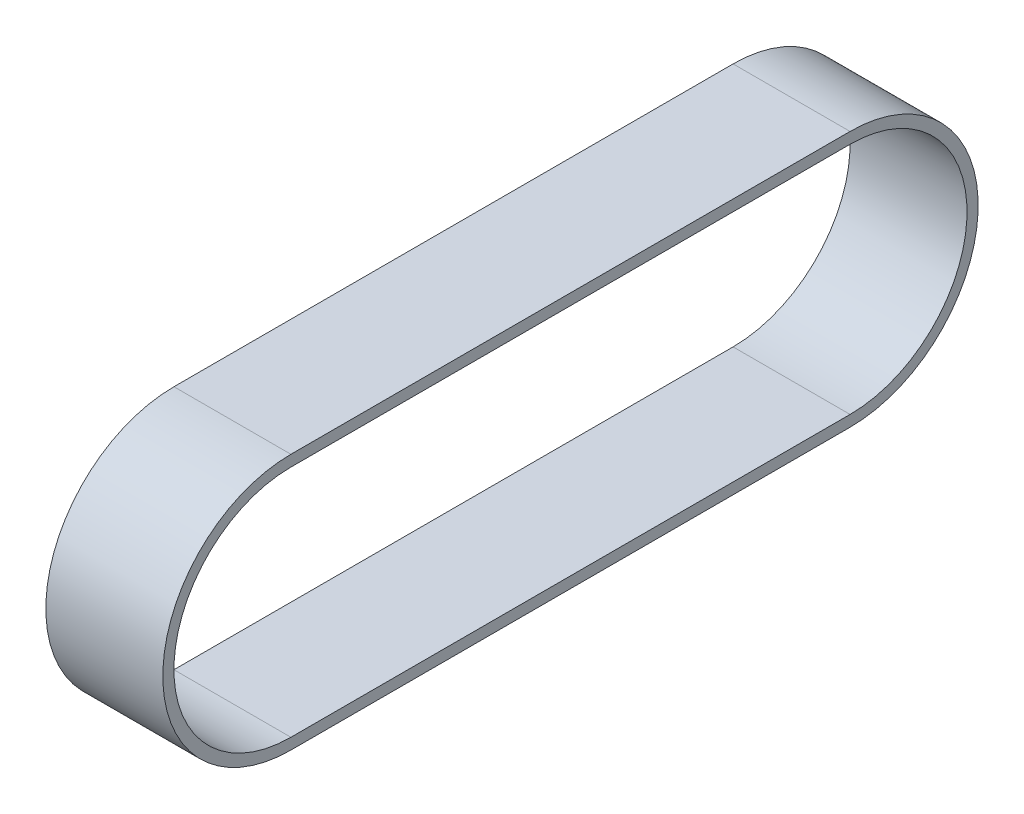
ISO-10303-21;
HEADER;
FILE_DESCRIPTION(('STEP AP214'),'2;1');
FILE_NAME('part.step','',(''),(''),'','','');
FILE_SCHEMA(('AUTOMOTIVE_DESIGN { 1 0 10303 214 1 1 1 1 }'));
ENDSEC;
DATA;
#1=APPLICATION_CONTEXT('core data for automotive mechanical design processes');
#2=APPLICATION_PROTOCOL_DEFINITION('international standard','automotive_design',2000,#1);
#3=PRODUCT_CONTEXT('',#1,'mechanical');
#4=PRODUCT('Part','Part','',(#3));
#5=PRODUCT_RELATED_PRODUCT_CATEGORY('part','',(#4));
#6=PRODUCT_DEFINITION_FORMATION('','',#4);
#7=PRODUCT_DEFINITION_CONTEXT('part definition',#1,'design');
#8=PRODUCT_DEFINITION('design','',#6,#7);
#9=PRODUCT_DEFINITION_SHAPE('','',#8);
#10=(LENGTH_UNIT() NAMED_UNIT(*) SI_UNIT(.MILLI.,.METRE.));
#11=(NAMED_UNIT(*) PLANE_ANGLE_UNIT() SI_UNIT($,.RADIAN.));
#12=(NAMED_UNIT(*) SI_UNIT($,.STERADIAN.) SOLID_ANGLE_UNIT());
#13=UNCERTAINTY_MEASURE_WITH_UNIT(LENGTH_MEASURE(1.E-05),#10,'distance_accuracy_value','');
#14=(GEOMETRIC_REPRESENTATION_CONTEXT(3) GLOBAL_UNCERTAINTY_ASSIGNED_CONTEXT((#13)) GLOBAL_UNIT_ASSIGNED_CONTEXT((#10,
#11,#12)) REPRESENTATION_CONTEXT('',''));
#15=CARTESIAN_POINT('',(0.,0.,0.));
#16=DIRECTION('',(0.,0.,1.));
#17=DIRECTION('',(1.,0.,0.));
#18=AXIS2_PLACEMENT_3D('',#15,#16,#17);
#19=CARTESIAN_POINT('',(50.,0.,41.9460431376817));
#20=DIRECTION('',(1.,0.,0.));
#21=DIRECTION('',(0.,0.,-1.));
#22=AXIS2_PLACEMENT_3D('',#19,#20,#21);
#23=PLANE('',#22);
#24=CARTESIAN_POINT('',(50.,0.,41.9460431376817));
#25=DIRECTION('',(1.,0.,0.));
#26=DIRECTION('',(0.,0.,-1.));
#27=AXIS2_PLACEMENT_3D('',#24,#25,#26);
#28=CIRCLE('',#27,54.752);
#29=CARTESIAN_POINT('',(50.,54.752,41.9460431376817));
#30=VERTEX_POINT('',#29);
#31=CARTESIAN_POINT('',(50.,-54.752,41.9460431376817));
#32=VERTEX_POINT('',#31);
#33=EDGE_CURVE('E153',#30,#32,#28,.T.);
#34=ORIENTED_EDGE('',*,*,#33,.T.);
#35=DIRECTION('',(0.,0.,-1.));
#36=VECTOR('',#35,1.);
#37=CARTESIAN_POINT('',(50.,-54.752,41.9460431376817));
#38=LINE('',#37,#36);
#39=CARTESIAN_POINT('',(50.,-54.752,-197.053956862318));
#40=VERTEX_POINT('',#39);
#41=EDGE_CURVE('E157',#32,#40,#38,.T.);
#42=ORIENTED_EDGE('',*,*,#41,.T.);
#43=CARTESIAN_POINT('',(50.,0.,-197.053956862318));
#44=DIRECTION('',(1.,0.,0.));
#45=DIRECTION('',(0.,0.,-1.));
#46=AXIS2_PLACEMENT_3D('',#43,#44,#45);
#47=CIRCLE('',#46,54.752);
#48=CARTESIAN_POINT('',(50.,54.752,-197.053956862318));
#49=VERTEX_POINT('',#48);
#50=EDGE_CURVE('E161',#40,#49,#47,.T.);
#51=ORIENTED_EDGE('',*,*,#50,.T.);
#52=DIRECTION('',(0.,0.,1.));
#53=VECTOR('',#52,1.);
#54=CARTESIAN_POINT('',(50.,54.752,41.9460431376817));
#55=LINE('',#54,#53);
#56=EDGE_CURVE('E164',#49,#30,#55,.T.);
#57=ORIENTED_EDGE('',*,*,#56,.T.);
#58=EDGE_LOOP('',(#34,#42,#51,#57));
#59=FACE_BOUND('',#58,.T.);
#60=DIRECTION('',(0.,0.,-1.));
#61=VECTOR('',#60,1.);
#62=CARTESIAN_POINT('',(50.,-50.,41.9460431376817));
#63=LINE('',#62,#61);
#64=CARTESIAN_POINT('',(50.,-50.,41.9460431376817));
#65=VERTEX_POINT('',#64);
#66=CARTESIAN_POINT('',(50.,-50.,-197.053956862318));
#67=VERTEX_POINT('',#66);
#68=EDGE_CURVE('E114',#65,#67,#63,.T.);
#69=ORIENTED_EDGE('',*,*,#68,.F.);
#70=CARTESIAN_POINT('',(50.,0.,41.9460431376817));
#71=DIRECTION('',(1.,0.,0.));
#72=DIRECTION('',(0.,0.,-1.));
#73=AXIS2_PLACEMENT_3D('',#70,#71,#72);
#74=CIRCLE('',#73,50.);
#75=CARTESIAN_POINT('',(50.,50.,41.9460431376817));
#76=VERTEX_POINT('',#75);
#77=EDGE_CURVE('E105',#76,#65,#74,.T.);
#78=ORIENTED_EDGE('',*,*,#77,.F.);
#79=DIRECTION('',(0.,0.,1.));
#80=VECTOR('',#79,1.);
#81=CARTESIAN_POINT('',(50.,50.,41.9460431376817));
#82=LINE('',#81,#80);
#83=CARTESIAN_POINT('',(50.,50.,-197.053956862318));
#84=VERTEX_POINT('',#83);
#85=EDGE_CURVE('E131',#84,#76,#82,.T.);
#86=ORIENTED_EDGE('',*,*,#85,.F.);
#87=CARTESIAN_POINT('',(50.,0.,-197.053956862318));
#88=DIRECTION('',(1.,0.,0.));
#89=DIRECTION('',(0.,0.,-1.));
#90=AXIS2_PLACEMENT_3D('',#87,#88,#89);
#91=CIRCLE('',#90,50.);
#92=EDGE_CURVE('E127',#67,#84,#91,.T.);
#93=ORIENTED_EDGE('',*,*,#92,.F.);
#94=EDGE_LOOP('',(#69,#78,#86,#93));
#95=FACE_BOUND('',#94,.T.);
#96=ADVANCED_FACE('F39',(#59,#95),#23,.T.);
#97=CARTESIAN_POINT('',(0.,0.,41.9460431376817));
#98=DIRECTION('',(1.,0.,0.));
#99=DIRECTION('',(0.,0.,-1.));
#100=AXIS2_PLACEMENT_3D('',#97,#98,#99);
#101=PLANE('',#100);
#102=CARTESIAN_POINT('',(0.,0.,41.9460431376817));
#103=DIRECTION('',(1.,0.,0.));
#104=DIRECTION('',(0.,0.,-1.));
#105=AXIS2_PLACEMENT_3D('',#102,#103,#104);
#106=CIRCLE('',#105,54.752);
#107=CARTESIAN_POINT('',(0.,54.752,41.9460431376817));
#108=VERTEX_POINT('',#107);
#109=CARTESIAN_POINT('',(0.,-54.752,41.9460431376817));
#110=VERTEX_POINT('',#109);
#111=EDGE_CURVE('E123',#108,#110,#106,.T.);
#112=ORIENTED_EDGE('',*,*,#111,.F.);
#113=DIRECTION('',(0.,0.,1.));
#114=VECTOR('',#113,1.);
#115=CARTESIAN_POINT('',(0.,54.752,41.9460431376817));
#116=LINE('',#115,#114);
#117=CARTESIAN_POINT('',(0.,54.752,-197.053956862318));
#118=VERTEX_POINT('',#117);
#119=EDGE_CURVE('E158',#118,#108,#116,.T.);
#120=ORIENTED_EDGE('',*,*,#119,.F.);
#121=CARTESIAN_POINT('',(0.,0.,-197.053956862318));
#122=DIRECTION('',(1.,0.,0.));
#123=DIRECTION('',(0.,0.,-1.));
#124=AXIS2_PLACEMENT_3D('',#121,#122,#123);
#125=CIRCLE('',#124,54.752);
#126=CARTESIAN_POINT('',(0.,-54.752,-197.053956862318));
#127=VERTEX_POINT('',#126);
#128=EDGE_CURVE('E174',#127,#118,#125,.T.);
#129=ORIENTED_EDGE('',*,*,#128,.F.);
#130=DIRECTION('',(0.,0.,-1.));
#131=VECTOR('',#130,1.);
#132=CARTESIAN_POINT('',(0.,-54.752,41.9460431376817));
#133=LINE('',#132,#131);
#134=EDGE_CURVE('E171',#110,#127,#133,.T.);
#135=ORIENTED_EDGE('',*,*,#134,.F.);
#136=EDGE_LOOP('',(#112,#120,#129,#135));
#137=FACE_BOUND('',#136,.T.);
#138=CARTESIAN_POINT('',(0.,0.,41.9460431376817));
#139=DIRECTION('',(1.,0.,0.));
#140=DIRECTION('',(0.,0.,-1.));
#141=AXIS2_PLACEMENT_3D('',#138,#139,#140);
#142=CIRCLE('',#141,50.);
#143=CARTESIAN_POINT('',(0.,50.,41.9460431376817));
#144=VERTEX_POINT('',#143);
#145=CARTESIAN_POINT('',(0.,-50.,41.9460431376817));
#146=VERTEX_POINT('',#145);
#147=EDGE_CURVE('E63',#144,#146,#142,.T.);
#148=ORIENTED_EDGE('',*,*,#147,.T.);
#149=DIRECTION('',(0.,0.,-1.));
#150=VECTOR('',#149,1.);
#151=CARTESIAN_POINT('',(0.,-50.,41.9460431376817));
#152=LINE('',#151,#150);
#153=CARTESIAN_POINT('',(0.,-50.,-197.053956862318));
#154=VERTEX_POINT('',#153);
#155=EDGE_CURVE('E121',#146,#154,#152,.T.);
#156=ORIENTED_EDGE('',*,*,#155,.T.);
#157=CARTESIAN_POINT('',(0.,0.,-197.053956862318));
#158=DIRECTION('',(1.,0.,0.));
#159=DIRECTION('',(0.,0.,-1.));
#160=AXIS2_PLACEMENT_3D('',#157,#158,#159);
#161=CIRCLE('',#160,50.);
#162=CARTESIAN_POINT('',(0.,50.,-197.053956862318));
#163=VERTEX_POINT('',#162);
#164=EDGE_CURVE('E140',#154,#163,#161,.T.);
#165=ORIENTED_EDGE('',*,*,#164,.T.);
#166=DIRECTION('',(0.,0.,1.));
#167=VECTOR('',#166,1.);
#168=CARTESIAN_POINT('',(0.,50.,41.9460431376817));
#169=LINE('',#168,#167);
#170=EDGE_CURVE('E115',#163,#144,#169,.T.);
#171=ORIENTED_EDGE('',*,*,#170,.T.);
#172=EDGE_LOOP('',(#148,#156,#165,#171));
#173=FACE_BOUND('',#172,.T.);
#174=ADVANCED_FACE('F197',(#137,#173),#101,.F.);
#175=CARTESIAN_POINT('',(50.,0.,41.9460431376817));
#176=DIRECTION('',(-1.,0.,0.));
#177=DIRECTION('',(0.,0.,1.));
#178=AXIS2_PLACEMENT_3D('',#175,#176,#177);
#179=CYLINDRICAL_SURFACE('',#178,54.752);
#180=ORIENTED_EDGE('',*,*,#111,.T.);
#181=DIRECTION('',(-1.,0.,0.));
#182=VECTOR('',#181,1.);
#183=CARTESIAN_POINT('',(50.,-54.752,41.9460431376817));
#184=LINE('',#183,#182);
#185=EDGE_CURVE('E11',#32,#110,#184,.T.);
#186=ORIENTED_EDGE('',*,*,#185,.F.);
#187=ORIENTED_EDGE('',*,*,#33,.F.);
#188=DIRECTION('',(-1.,0.,0.));
#189=VECTOR('',#188,1.);
#190=CARTESIAN_POINT('',(50.,54.752,41.9460431376817));
#191=LINE('',#190,#189);
#192=EDGE_CURVE('E167',#30,#108,#191,.T.);
#193=ORIENTED_EDGE('',*,*,#192,.T.);
#194=EDGE_LOOP('',(#180,#186,#187,#193));
#195=FACE_BOUND('',#194,.T.);
#196=ADVANCED_FACE('F41',(#195),#179,.T.);
#197=CARTESIAN_POINT('',(50.,-54.752,41.9460431376817));
#198=DIRECTION('',(0.,1.,0.));
#199=DIRECTION('',(0.,0.,1.));
#200=AXIS2_PLACEMENT_3D('',#197,#198,#199);
#201=PLANE('',#200);
#202=ORIENTED_EDGE('',*,*,#134,.T.);
#203=DIRECTION('',(-1.,0.,0.));
#204=VECTOR('',#203,1.);
#205=CARTESIAN_POINT('',(50.,-54.752,-197.053956862318));
#206=LINE('',#205,#204);
#207=EDGE_CURVE('E48',#40,#127,#206,.T.);
#208=ORIENTED_EDGE('',*,*,#207,.F.);
#209=ORIENTED_EDGE('',*,*,#41,.F.);
#210=ORIENTED_EDGE('',*,*,#185,.T.);
#211=EDGE_LOOP('',(#202,#208,#209,#210));
#212=FACE_BOUND('',#211,.T.);
#213=ADVANCED_FACE('F207',(#212),#201,.F.);
#214=CARTESIAN_POINT('',(50.,0.,-197.053956862318));
#215=DIRECTION('',(-1.,0.,0.));
#216=DIRECTION('',(0.,0.,1.));
#217=AXIS2_PLACEMENT_3D('',#214,#215,#216);
#218=CYLINDRICAL_SURFACE('',#217,54.752);
#219=ORIENTED_EDGE('',*,*,#128,.T.);
#220=DIRECTION('',(-1.,0.,0.));
#221=VECTOR('',#220,1.);
#222=CARTESIAN_POINT('',(50.,54.752,-197.053956862318));
#223=LINE('',#222,#221);
#224=EDGE_CURVE('E182',#49,#118,#223,.T.);
#225=ORIENTED_EDGE('',*,*,#224,.F.);
#226=ORIENTED_EDGE('',*,*,#50,.F.);
#227=ORIENTED_EDGE('',*,*,#207,.T.);
#228=EDGE_LOOP('',(#219,#225,#226,#227));
#229=FACE_BOUND('',#228,.T.);
#230=ADVANCED_FACE('F191',(#229),#218,.T.);
#231=CARTESIAN_POINT('',(50.,54.752,41.9460431376817));
#232=DIRECTION('',(0.,-1.,0.));
#233=DIRECTION('',(0.,0.,-1.));
#234=AXIS2_PLACEMENT_3D('',#231,#232,#233);
#235=PLANE('',#234);
#236=ORIENTED_EDGE('',*,*,#119,.T.);
#237=ORIENTED_EDGE('',*,*,#192,.F.);
#238=ORIENTED_EDGE('',*,*,#56,.F.);
#239=ORIENTED_EDGE('',*,*,#224,.T.);
#240=EDGE_LOOP('',(#236,#237,#238,#239));
#241=FACE_BOUND('',#240,.T.);
#242=ADVANCED_FACE('F201',(#241),#235,.F.);
#243=CARTESIAN_POINT('',(50.,0.,41.9460431376817));
#244=DIRECTION('',(-1.,0.,0.));
#245=DIRECTION('',(0.,0.,1.));
#246=AXIS2_PLACEMENT_3D('',#243,#244,#245);
#247=CYLINDRICAL_SURFACE('',#246,50.);
#248=ORIENTED_EDGE('',*,*,#147,.F.);
#249=DIRECTION('',(-1.,0.,0.));
#250=VECTOR('',#249,1.);
#251=CARTESIAN_POINT('',(50.,50.,41.9460431376817));
#252=LINE('',#251,#250);
#253=EDGE_CURVE('E109',#76,#144,#252,.T.);
#254=ORIENTED_EDGE('',*,*,#253,.F.);
#255=ORIENTED_EDGE('',*,*,#77,.T.);
#256=DIRECTION('',(-1.,0.,0.));
#257=VECTOR('',#256,1.);
#258=CARTESIAN_POINT('',(50.,-50.,41.9460431376817));
#259=LINE('',#258,#257);
#260=EDGE_CURVE('E108',#65,#146,#259,.T.);
#261=ORIENTED_EDGE('',*,*,#260,.T.);
#262=EDGE_LOOP('',(#248,#254,#255,#261));
#263=FACE_BOUND('',#262,.T.);
#264=ADVANCED_FACE('F107',(#263),#247,.F.);
#265=CARTESIAN_POINT('',(50.,-50.,41.9460431376817));
#266=DIRECTION('',(0.,1.,0.));
#267=DIRECTION('',(0.,0.,1.));
#268=AXIS2_PLACEMENT_3D('',#265,#266,#267);
#269=PLANE('',#268);
#270=ORIENTED_EDGE('',*,*,#155,.F.);
#271=ORIENTED_EDGE('',*,*,#260,.F.);
#272=ORIENTED_EDGE('',*,*,#68,.T.);
#273=DIRECTION('',(-1.,0.,0.));
#274=VECTOR('',#273,1.);
#275=CARTESIAN_POINT('',(50.,-50.,-197.053956862318));
#276=LINE('',#275,#274);
#277=EDGE_CURVE('E124',#67,#154,#276,.T.);
#278=ORIENTED_EDGE('',*,*,#277,.T.);
#279=EDGE_LOOP('',(#270,#271,#272,#278));
#280=FACE_BOUND('',#279,.T.);
#281=ADVANCED_FACE('F118',(#280),#269,.T.);
#282=CARTESIAN_POINT('',(50.,0.,-197.053956862318));
#283=DIRECTION('',(-1.,0.,0.));
#284=DIRECTION('',(0.,0.,1.));
#285=AXIS2_PLACEMENT_3D('',#282,#283,#284);
#286=CYLINDRICAL_SURFACE('',#285,50.);
#287=ORIENTED_EDGE('',*,*,#164,.F.);
#288=ORIENTED_EDGE('',*,*,#277,.F.);
#289=ORIENTED_EDGE('',*,*,#92,.T.);
#290=DIRECTION('',(-1.,0.,0.));
#291=VECTOR('',#290,1.);
#292=CARTESIAN_POINT('',(50.,50.,-197.053956862318));
#293=LINE('',#292,#291);
#294=EDGE_CURVE('E55',#84,#163,#293,.T.);
#295=ORIENTED_EDGE('',*,*,#294,.T.);
#296=EDGE_LOOP('',(#287,#288,#289,#295));
#297=FACE_BOUND('',#296,.T.);
#298=ADVANCED_FACE('F230',(#297),#286,.F.);
#299=CARTESIAN_POINT('',(50.,50.,41.9460431376817));
#300=DIRECTION('',(0.,-1.,0.));
#301=DIRECTION('',(0.,0.,-1.));
#302=AXIS2_PLACEMENT_3D('',#299,#300,#301);
#303=PLANE('',#302);
#304=ORIENTED_EDGE('',*,*,#170,.F.);
#305=ORIENTED_EDGE('',*,*,#294,.F.);
#306=ORIENTED_EDGE('',*,*,#85,.T.);
#307=ORIENTED_EDGE('',*,*,#253,.T.);
#308=EDGE_LOOP('',(#304,#305,#306,#307));
#309=FACE_BOUND('',#308,.T.);
#310=ADVANCED_FACE('F234',(#309),#303,.T.);
#311=CLOSED_SHELL('',(#96,#174,#196,#213,#230,#242,#264,#281,#298,#310));
#312=MANIFOLD_SOLID_BREP('B2',#311);
#313=ADVANCED_BREP_SHAPE_REPRESENTATION('',(#18,#312),#14);
#314=SHAPE_DEFINITION_REPRESENTATION(#9,#313);
ENDSEC;
END-ISO-10303-21;
